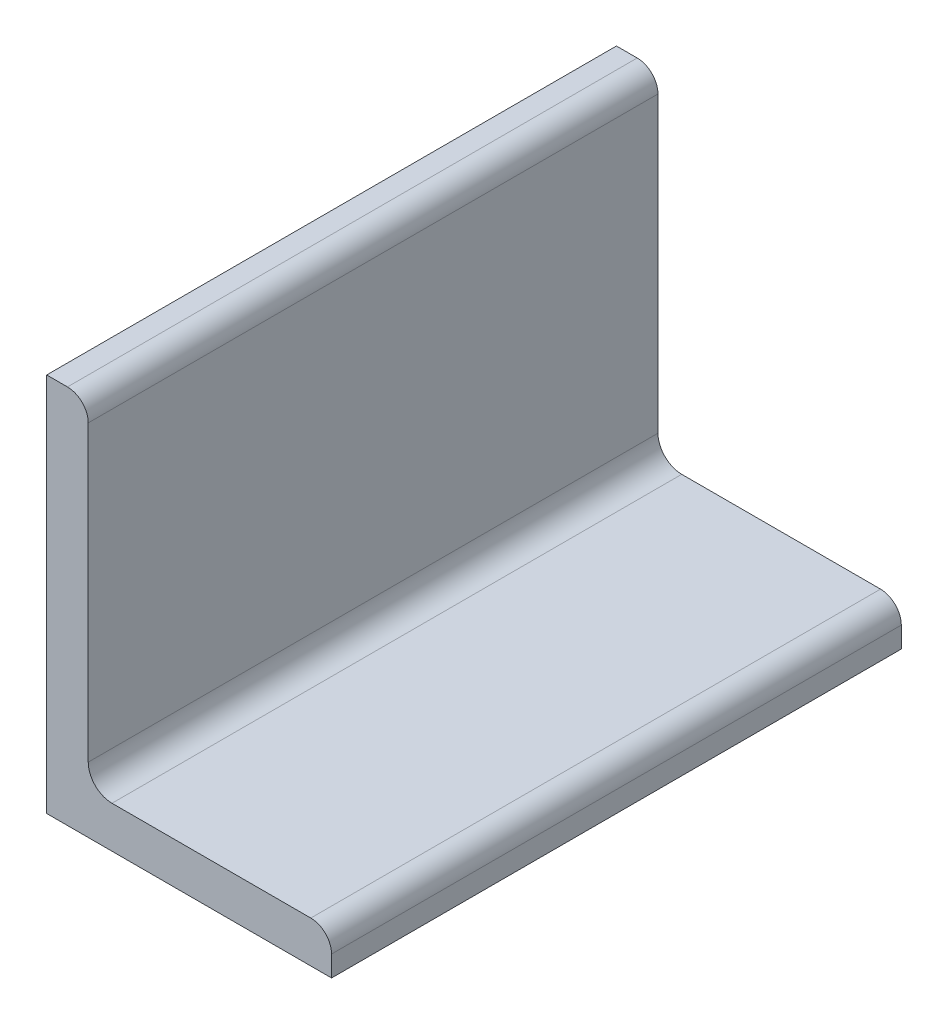
ISO-10303-21;
HEADER;
FILE_DESCRIPTION(('STEP AP214'),'2;1');
FILE_NAME('part.step','',(''),(''),'','','');
FILE_SCHEMA(('AUTOMOTIVE_DESIGN { 1 0 10303 214 1 1 1 1 }'));
ENDSEC;
DATA;
#1=APPLICATION_CONTEXT('core data for automotive mechanical design processes');
#2=APPLICATION_PROTOCOL_DEFINITION('international standard','automotive_design',2000,#1);
#3=PRODUCT_CONTEXT('',#1,'mechanical');
#4=PRODUCT('Part','Part','',(#3));
#5=PRODUCT_RELATED_PRODUCT_CATEGORY('part','',(#4));
#6=PRODUCT_DEFINITION_FORMATION('','',#4);
#7=PRODUCT_DEFINITION_CONTEXT('part definition',#1,'design');
#8=PRODUCT_DEFINITION('design','',#6,#7);
#9=PRODUCT_DEFINITION_SHAPE('','',#8);
#10=(LENGTH_UNIT() NAMED_UNIT(*) SI_UNIT(.MILLI.,.METRE.));
#11=(NAMED_UNIT(*) PLANE_ANGLE_UNIT() SI_UNIT($,.RADIAN.));
#12=(NAMED_UNIT(*) SI_UNIT($,.STERADIAN.) SOLID_ANGLE_UNIT());
#13=UNCERTAINTY_MEASURE_WITH_UNIT(LENGTH_MEASURE(1.E-05),#10,'distance_accuracy_value','');
#14=(GEOMETRIC_REPRESENTATION_CONTEXT(3) GLOBAL_UNCERTAINTY_ASSIGNED_CONTEXT((#13)) GLOBAL_UNIT_ASSIGNED_CONTEXT((#10,
#11,#12)) REPRESENTATION_CONTEXT('',''));
#15=CARTESIAN_POINT('',(0.,0.,0.));
#16=DIRECTION('',(0.,0.,1.));
#17=DIRECTION('',(1.,0.,0.));
#18=AXIS2_PLACEMENT_3D('',#15,#16,#17);
#19=CARTESIAN_POINT('',(0.425014111727251,203.678837479772,304.8));
#20=DIRECTION('',(1.,0.,0.));
#21=DIRECTION('',(0.,0.,-1.));
#22=AXIS2_PLACEMENT_3D('',#19,#20,#21);
#23=PLANE('',#22);
#24=DIRECTION('',(0.,-1.,0.));
#25=VECTOR('',#24,1.);
#26=CARTESIAN_POINT('',(0.425014111727251,203.678837479772,0.));
#27=LINE('',#26,#25);
#28=CARTESIAN_POINT('',(0.425014111727251,203.678837479772,0.));
#29=VERTEX_POINT('',#28);
#30=CARTESIAN_POINT('',(0.425014111727251,0.478837479771528,0.));
#31=VERTEX_POINT('',#30);
#32=EDGE_CURVE('E135',#29,#31,#27,.T.);
#33=ORIENTED_EDGE('',*,*,#32,.T.);
#34=DIRECTION('',(0.,0.,-1.));
#35=VECTOR('',#34,1.);
#36=CARTESIAN_POINT('',(0.425014111727251,0.478837479771528,304.8));
#37=LINE('',#36,#35);
#38=CARTESIAN_POINT('',(0.425014111727251,0.478837479771528,304.8));
#39=VERTEX_POINT('',#38);
#40=EDGE_CURVE('E11',#39,#31,#37,.T.);
#41=ORIENTED_EDGE('',*,*,#40,.F.);
#42=DIRECTION('',(0.,-1.,0.));
#43=VECTOR('',#42,1.);
#44=CARTESIAN_POINT('',(0.425014111727251,203.678837479772,304.8));
#45=LINE('',#44,#43);
#46=CARTESIAN_POINT('',(0.425014111727251,203.678837479772,304.8));
#47=VERTEX_POINT('',#46);
#48=EDGE_CURVE('E151',#47,#39,#45,.T.);
#49=ORIENTED_EDGE('',*,*,#48,.F.);
#50=DIRECTION('',(0.,0.,-1.));
#51=VECTOR('',#50,1.);
#52=CARTESIAN_POINT('',(0.425014111727251,203.678837479772,304.8));
#53=LINE('',#52,#51);
#54=EDGE_CURVE('E131',#47,#29,#53,.T.);
#55=ORIENTED_EDGE('',*,*,#54,.T.);
#56=EDGE_LOOP('',(#33,#41,#49,#55));
#57=FACE_BOUND('',#56,.T.);
#58=ADVANCED_FACE('F33',(#57),#23,.F.);
#59=CARTESIAN_POINT('',(0.425014111727251,0.478837479771528,304.8));
#60=DIRECTION('',(0.,1.,0.));
#61=DIRECTION('',(0.,0.,1.));
#62=AXIS2_PLACEMENT_3D('',#59,#60,#61);
#63=PLANE('',#62);
#64=DIRECTION('',(1.,0.,0.));
#65=VECTOR('',#64,1.);
#66=CARTESIAN_POINT('',(0.425014111727251,0.478837479771528,0.));
#67=LINE('',#66,#65);
#68=CARTESIAN_POINT('',(152.825014111727,0.478837479771528,0.));
#69=VERTEX_POINT('',#68);
#70=EDGE_CURVE('E138',#31,#69,#67,.T.);
#71=ORIENTED_EDGE('',*,*,#70,.T.);
#72=DIRECTION('',(0.,0.,-1.));
#73=VECTOR('',#72,1.);
#74=CARTESIAN_POINT('',(152.825014111727,0.478837479771528,304.8));
#75=LINE('',#74,#73);
#76=CARTESIAN_POINT('',(152.825014111727,0.478837479771528,304.8));
#77=VERTEX_POINT('',#76);
#78=EDGE_CURVE('E41',#77,#69,#75,.T.);
#79=ORIENTED_EDGE('',*,*,#78,.F.);
#80=DIRECTION('',(1.,0.,0.));
#81=VECTOR('',#80,1.);
#82=CARTESIAN_POINT('',(0.425014111727251,0.478837479771528,304.8));
#83=LINE('',#82,#81);
#84=EDGE_CURVE('E95',#39,#77,#83,.T.);
#85=ORIENTED_EDGE('',*,*,#84,.F.);
#86=ORIENTED_EDGE('',*,*,#40,.T.);
#87=EDGE_LOOP('',(#71,#79,#85,#86));
#88=FACE_BOUND('',#87,.T.);
#89=ADVANCED_FACE('F194',(#88),#63,.F.);
#90=CARTESIAN_POINT('',(152.825014111727,0.478837479771528,304.8));
#91=DIRECTION('',(-1.,0.,0.));
#92=DIRECTION('',(0.,0.,1.));
#93=AXIS2_PLACEMENT_3D('',#90,#91,#92);
#94=PLANE('',#93);
#95=DIRECTION('',(0.,1.,0.));
#96=VECTOR('',#95,1.);
#97=CARTESIAN_POINT('',(152.825014111727,0.478837479771528,0.));
#98=LINE('',#97,#96);
#99=CARTESIAN_POINT('',(152.825014111727,11.5913374797715,0.));
#100=VERTEX_POINT('',#99);
#101=EDGE_CURVE('E140',#69,#100,#98,.T.);
#102=ORIENTED_EDGE('',*,*,#101,.T.);
#103=DIRECTION('',(0.,0.,-1.));
#104=VECTOR('',#103,1.);
#105=CARTESIAN_POINT('',(152.825014111727,11.5913374797715,304.8));
#106=LINE('',#105,#104);
#107=CARTESIAN_POINT('',(152.825014111727,11.5913374797715,304.8));
#108=VERTEX_POINT('',#107);
#109=EDGE_CURVE('E161',#108,#100,#106,.T.);
#110=ORIENTED_EDGE('',*,*,#109,.F.);
#111=DIRECTION('',(0.,1.,0.));
#112=VECTOR('',#111,1.);
#113=CARTESIAN_POINT('',(152.825014111727,0.478837479771528,304.8));
#114=LINE('',#113,#112);
#115=EDGE_CURVE('E169',#77,#108,#114,.T.);
#116=ORIENTED_EDGE('',*,*,#115,.F.);
#117=ORIENTED_EDGE('',*,*,#78,.T.);
#118=EDGE_LOOP('',(#102,#110,#116,#117));
#119=FACE_BOUND('',#118,.T.);
#120=ADVANCED_FACE('F167',(#119),#94,.F.);
#121=CARTESIAN_POINT('',(141.712514111727,11.5913374797715,304.8));
#122=DIRECTION('',(0.,0.,-1.));
#123=DIRECTION('',(-1.,0.,0.));
#124=AXIS2_PLACEMENT_3D('',#121,#122,#123);
#125=CYLINDRICAL_SURFACE('',#124,11.1125);
#126=CARTESIAN_POINT('',(141.712514111727,11.5913374797715,0.));
#127=DIRECTION('',(0.,0.,1.));
#128=DIRECTION('',(1.,0.,0.));
#129=AXIS2_PLACEMENT_3D('',#126,#127,#128);
#130=CIRCLE('',#129,11.1125);
#131=CARTESIAN_POINT('',(141.712514111727,22.7038374797715,0.));
#132=VERTEX_POINT('',#131);
#133=EDGE_CURVE('E142',#100,#132,#130,.T.);
#134=ORIENTED_EDGE('',*,*,#133,.T.);
#135=DIRECTION('',(0.,0.,-1.));
#136=VECTOR('',#135,1.);
#137=CARTESIAN_POINT('',(141.712514111727,22.7038374797715,304.8));
#138=LINE('',#137,#136);
#139=CARTESIAN_POINT('',(141.712514111727,22.7038374797715,304.8));
#140=VERTEX_POINT('',#139);
#141=EDGE_CURVE('E158',#140,#132,#138,.T.);
#142=ORIENTED_EDGE('',*,*,#141,.F.);
#143=CARTESIAN_POINT('',(141.712514111727,11.5913374797715,304.8));
#144=DIRECTION('',(0.,0.,1.));
#145=DIRECTION('',(1.,0.,0.));
#146=AXIS2_PLACEMENT_3D('',#143,#144,#145);
#147=CIRCLE('',#146,11.1125);
#148=EDGE_CURVE('E185',#108,#140,#147,.T.);
#149=ORIENTED_EDGE('',*,*,#148,.F.);
#150=ORIENTED_EDGE('',*,*,#109,.T.);
#151=EDGE_LOOP('',(#134,#142,#149,#150));
#152=FACE_BOUND('',#151,.T.);
#153=ADVANCED_FACE('F178',(#152),#125,.T.);
#154=CARTESIAN_POINT('',(141.712514111727,22.7038374797715,304.8));
#155=DIRECTION('',(0.,-1.,0.));
#156=DIRECTION('',(1.,0.,0.));
#157=AXIS2_PLACEMENT_3D('',#154,#155,#156);
#158=PLANE('',#157);
#159=DIRECTION('',(-1.,0.,0.));
#160=VECTOR('',#159,1.);
#161=CARTESIAN_POINT('',(141.712514111727,22.7038374797715,0.));
#162=LINE('',#161,#160);
#163=CARTESIAN_POINT('',(35.3500141117272,22.7038374797716,0.));
#164=VERTEX_POINT('',#163);
#165=EDGE_CURVE('E144',#132,#164,#162,.T.);
#166=ORIENTED_EDGE('',*,*,#165,.T.);
#167=DIRECTION('',(0.,0.,-1.));
#168=VECTOR('',#167,1.);
#169=CARTESIAN_POINT('',(35.3500141117272,22.7038374797716,304.8));
#170=LINE('',#169,#168);
#171=CARTESIAN_POINT('',(35.3500141117272,22.7038374797716,304.8));
#172=VERTEX_POINT('',#171);
#173=EDGE_CURVE('E155',#172,#164,#170,.T.);
#174=ORIENTED_EDGE('',*,*,#173,.F.);
#175=DIRECTION('',(-1.,0.,0.));
#176=VECTOR('',#175,1.);
#177=CARTESIAN_POINT('',(141.712514111727,22.7038374797715,304.8));
#178=LINE('',#177,#176);
#179=EDGE_CURVE('E184',#140,#172,#178,.T.);
#180=ORIENTED_EDGE('',*,*,#179,.F.);
#181=ORIENTED_EDGE('',*,*,#141,.T.);
#182=EDGE_LOOP('',(#166,#174,#180,#181));
#183=FACE_BOUND('',#182,.T.);
#184=ADVANCED_FACE('F182',(#183),#158,.F.);
#185=CARTESIAN_POINT('',(35.3500141117272,35.4038374797715,304.8));
#186=DIRECTION('',(0.,0.,-1.));
#187=DIRECTION('',(-1.,0.,0.));
#188=AXIS2_PLACEMENT_3D('',#185,#186,#187);
#189=CYLINDRICAL_SURFACE('',#188,12.7);
#190=CARTESIAN_POINT('',(35.3500141117272,35.4038374797715,0.));
#191=DIRECTION('',(0.,0.,-1.));
#192=DIRECTION('',(1.,0.,0.));
#193=AXIS2_PLACEMENT_3D('',#190,#191,#192);
#194=CIRCLE('',#193,12.7);
#195=CARTESIAN_POINT('',(22.6500141117273,35.4038374797715,0.));
#196=VERTEX_POINT('',#195);
#197=EDGE_CURVE('E146',#164,#196,#194,.T.);
#198=ORIENTED_EDGE('',*,*,#197,.T.);
#199=DIRECTION('',(0.,0.,-1.));
#200=VECTOR('',#199,1.);
#201=CARTESIAN_POINT('',(22.6500141117273,35.4038374797715,304.8));
#202=LINE('',#201,#200);
#203=CARTESIAN_POINT('',(22.6500141117273,35.4038374797715,304.8));
#204=VERTEX_POINT('',#203);
#205=EDGE_CURVE('E126',#204,#196,#202,.T.);
#206=ORIENTED_EDGE('',*,*,#205,.F.);
#207=CARTESIAN_POINT('',(35.3500141117272,35.4038374797715,304.8));
#208=DIRECTION('',(0.,0.,-1.));
#209=DIRECTION('',(1.,0.,0.));
#210=AXIS2_PLACEMENT_3D('',#207,#208,#209);
#211=CIRCLE('',#210,12.7);
#212=EDGE_CURVE('E117',#172,#204,#211,.T.);
#213=ORIENTED_EDGE('',*,*,#212,.F.);
#214=ORIENTED_EDGE('',*,*,#173,.T.);
#215=EDGE_LOOP('',(#198,#206,#213,#214));
#216=FACE_BOUND('',#215,.T.);
#217=ADVANCED_FACE('F206',(#216),#189,.F.);
#218=CARTESIAN_POINT('',(22.6500141117273,35.4038374797715,304.8));
#219=DIRECTION('',(-1.,0.,0.));
#220=DIRECTION('',(0.,0.,1.));
#221=AXIS2_PLACEMENT_3D('',#218,#219,#220);
#222=PLANE('',#221);
#223=DIRECTION('',(0.,1.,0.));
#224=VECTOR('',#223,1.);
#225=CARTESIAN_POINT('',(22.6500141117273,35.4038374797715,0.));
#226=LINE('',#225,#224);
#227=CARTESIAN_POINT('',(22.6500141117273,192.566337479772,0.));
#228=VERTEX_POINT('',#227);
#229=EDGE_CURVE('E125',#196,#228,#226,.T.);
#230=ORIENTED_EDGE('',*,*,#229,.T.);
#231=DIRECTION('',(0.,0.,-1.));
#232=VECTOR('',#231,1.);
#233=CARTESIAN_POINT('',(22.6500141117273,192.566337479772,304.8));
#234=LINE('',#233,#232);
#235=CARTESIAN_POINT('',(22.6500141117273,192.566337479772,304.8));
#236=VERTEX_POINT('',#235);
#237=EDGE_CURVE('E122',#236,#228,#234,.T.);
#238=ORIENTED_EDGE('',*,*,#237,.F.);
#239=DIRECTION('',(0.,1.,0.));
#240=VECTOR('',#239,1.);
#241=CARTESIAN_POINT('',(22.6500141117273,35.4038374797715,304.8));
#242=LINE('',#241,#240);
#243=EDGE_CURVE('E111',#204,#236,#242,.T.);
#244=ORIENTED_EDGE('',*,*,#243,.F.);
#245=ORIENTED_EDGE('',*,*,#205,.T.);
#246=EDGE_LOOP('',(#230,#238,#244,#245));
#247=FACE_BOUND('',#246,.T.);
#248=ADVANCED_FACE('F123',(#247),#222,.F.);
#249=CARTESIAN_POINT('',(11.5375141117272,192.566337479772,304.8));
#250=DIRECTION('',(0.,0.,-1.));
#251=DIRECTION('',(-1.,0.,0.));
#252=AXIS2_PLACEMENT_3D('',#249,#250,#251);
#253=CYLINDRICAL_SURFACE('',#252,11.1125);
#254=CARTESIAN_POINT('',(11.5375141117272,192.566337479772,0.));
#255=DIRECTION('',(0.,0.,1.));
#256=DIRECTION('',(1.,0.,0.));
#257=AXIS2_PLACEMENT_3D('',#254,#255,#256);
#258=CIRCLE('',#257,11.1125);
#259=CARTESIAN_POINT('',(11.5375141117273,203.678837479772,0.));
#260=VERTEX_POINT('',#259);
#261=EDGE_CURVE('E81',#228,#260,#258,.T.);
#262=ORIENTED_EDGE('',*,*,#261,.T.);
#263=DIRECTION('',(0.,0.,-1.));
#264=VECTOR('',#263,1.);
#265=CARTESIAN_POINT('',(11.5375141117273,203.678837479772,304.8));
#266=LINE('',#265,#264);
#267=CARTESIAN_POINT('',(11.5375141117273,203.678837479772,304.8));
#268=VERTEX_POINT('',#267);
#269=EDGE_CURVE('E127',#268,#260,#266,.T.);
#270=ORIENTED_EDGE('',*,*,#269,.F.);
#271=CARTESIAN_POINT('',(11.5375141117272,192.566337479772,304.8));
#272=DIRECTION('',(0.,0.,1.));
#273=DIRECTION('',(1.,0.,0.));
#274=AXIS2_PLACEMENT_3D('',#271,#272,#273);
#275=CIRCLE('',#274,11.1125);
#276=EDGE_CURVE('E115',#236,#268,#275,.T.);
#277=ORIENTED_EDGE('',*,*,#276,.F.);
#278=ORIENTED_EDGE('',*,*,#237,.T.);
#279=EDGE_LOOP('',(#262,#270,#277,#278));
#280=FACE_BOUND('',#279,.T.);
#281=ADVANCED_FACE('F129',(#280),#253,.T.);
#282=CARTESIAN_POINT('',(11.5375141117273,203.678837479772,304.8));
#283=DIRECTION('',(0.,-1.,0.));
#284=DIRECTION('',(0.,0.,-1.));
#285=AXIS2_PLACEMENT_3D('',#282,#283,#284);
#286=PLANE('',#285);
#287=DIRECTION('',(-1.,0.,0.));
#288=VECTOR('',#287,1.);
#289=CARTESIAN_POINT('',(11.5375141117273,203.678837479772,0.));
#290=LINE('',#289,#288);
#291=EDGE_CURVE('E87',#260,#29,#290,.T.);
#292=ORIENTED_EDGE('',*,*,#291,.T.);
#293=ORIENTED_EDGE('',*,*,#54,.F.);
#294=DIRECTION('',(-1.,0.,0.));
#295=VECTOR('',#294,1.);
#296=CARTESIAN_POINT('',(11.5375141117273,203.678837479772,304.8));
#297=LINE('',#296,#295);
#298=EDGE_CURVE('E49',#268,#47,#297,.T.);
#299=ORIENTED_EDGE('',*,*,#298,.F.);
#300=ORIENTED_EDGE('',*,*,#269,.T.);
#301=EDGE_LOOP('',(#292,#293,#299,#300));
#302=FACE_BOUND('',#301,.T.);
#303=ADVANCED_FACE('F214',(#302),#286,.F.);
#304=CARTESIAN_POINT('',(141.712514111727,11.5913374797715,304.8));
#305=DIRECTION('',(0.,0.,1.));
#306=DIRECTION('',(1.,0.,0.));
#307=AXIS2_PLACEMENT_3D('',#304,#305,#306);
#308=PLANE('',#307);
#309=ORIENTED_EDGE('',*,*,#48,.T.);
#310=ORIENTED_EDGE('',*,*,#84,.T.);
#311=ORIENTED_EDGE('',*,*,#115,.T.);
#312=ORIENTED_EDGE('',*,*,#148,.T.);
#313=ORIENTED_EDGE('',*,*,#179,.T.);
#314=ORIENTED_EDGE('',*,*,#212,.T.);
#315=ORIENTED_EDGE('',*,*,#243,.T.);
#316=ORIENTED_EDGE('',*,*,#276,.T.);
#317=ORIENTED_EDGE('',*,*,#298,.T.);
#318=EDGE_LOOP('',(#309,#310,#311,#312,#313,#314,#315,#316,#317));
#319=FACE_BOUND('',#318,.T.);
#320=ADVANCED_FACE('F113',(#319),#308,.T.);
#321=CARTESIAN_POINT('',(141.712514111727,11.5913374797715,0.));
#322=DIRECTION('',(0.,0.,1.));
#323=DIRECTION('',(1.,0.,0.));
#324=AXIS2_PLACEMENT_3D('',#321,#322,#323);
#325=PLANE('',#324);
#326=ORIENTED_EDGE('',*,*,#32,.F.);
#327=ORIENTED_EDGE('',*,*,#291,.F.);
#328=ORIENTED_EDGE('',*,*,#261,.F.);
#329=ORIENTED_EDGE('',*,*,#229,.F.);
#330=ORIENTED_EDGE('',*,*,#197,.F.);
#331=ORIENTED_EDGE('',*,*,#165,.F.);
#332=ORIENTED_EDGE('',*,*,#133,.F.);
#333=ORIENTED_EDGE('',*,*,#101,.F.);
#334=ORIENTED_EDGE('',*,*,#70,.F.);
#335=EDGE_LOOP('',(#326,#327,#328,#329,#330,#331,#332,#333,#334));
#336=FACE_BOUND('',#335,.T.);
#337=ADVANCED_FACE('F173',(#336),#325,.F.);
#338=CLOSED_SHELL('',(#58,#89,#120,#153,#184,#217,#248,#281,#303,#320,#337));
#339=MANIFOLD_SOLID_BREP('B2',#338);
#340=ADVANCED_BREP_SHAPE_REPRESENTATION('',(#18,#339),#14);
#341=SHAPE_DEFINITION_REPRESENTATION(#9,#340);
ENDSEC;
END-ISO-10303-21;
